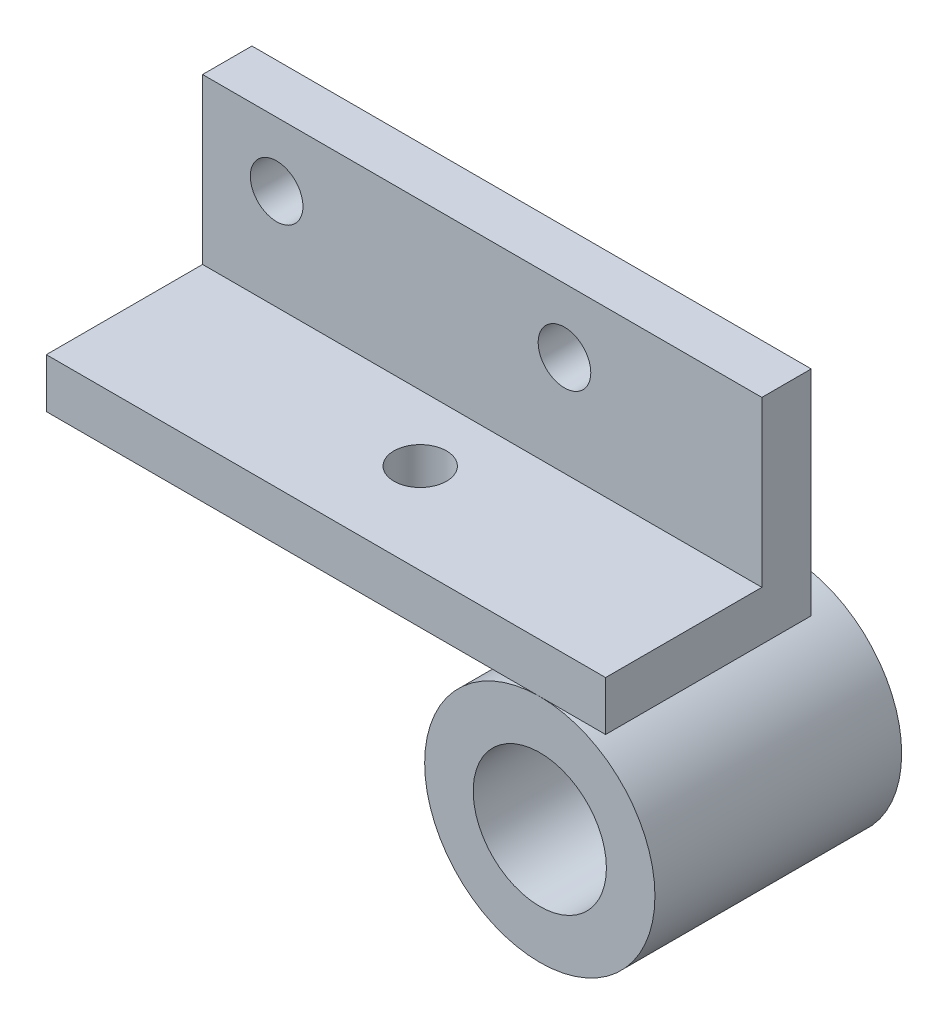
ISO-10303-21;
HEADER;
FILE_DESCRIPTION(('STEP AP214'),'2;1');
FILE_NAME('part.step','',(''),(''),'','','');
FILE_SCHEMA(('AUTOMOTIVE_DESIGN { 1 0 10303 214 1 1 1 1 }'));
ENDSEC;
DATA;
#1=APPLICATION_CONTEXT('core data for automotive mechanical design processes');
#2=APPLICATION_PROTOCOL_DEFINITION('international standard','automotive_design',2000,#1);
#3=PRODUCT_CONTEXT('',#1,'mechanical');
#4=PRODUCT('Part','Part','',(#3));
#5=PRODUCT_RELATED_PRODUCT_CATEGORY('part','',(#4));
#6=PRODUCT_DEFINITION_FORMATION('','',#4);
#7=PRODUCT_DEFINITION_CONTEXT('part definition',#1,'design');
#8=PRODUCT_DEFINITION('design','',#6,#7);
#9=PRODUCT_DEFINITION_SHAPE('','',#8);
#10=(LENGTH_UNIT() NAMED_UNIT(*) SI_UNIT(.MILLI.,.METRE.));
#11=(NAMED_UNIT(*) PLANE_ANGLE_UNIT() SI_UNIT($,.RADIAN.));
#12=(NAMED_UNIT(*) SI_UNIT($,.STERADIAN.) SOLID_ANGLE_UNIT());
#13=UNCERTAINTY_MEASURE_WITH_UNIT(LENGTH_MEASURE(1.E-05),#10,'distance_accuracy_value','');
#14=(GEOMETRIC_REPRESENTATION_CONTEXT(3) GLOBAL_UNCERTAINTY_ASSIGNED_CONTEXT((#13)) GLOBAL_UNIT_ASSIGNED_CONTEXT((#10,
#11,#12)) REPRESENTATION_CONTEXT('',''));
#15=CARTESIAN_POINT('',(0.,0.,0.));
#16=DIRECTION('',(0.,0.,1.));
#17=DIRECTION('',(1.,0.,0.));
#18=AXIS2_PLACEMENT_3D('',#15,#16,#17);
#19=CARTESIAN_POINT('',(30.,-7.,-15.));
#20=DIRECTION('',(0.,0.,1.));
#21=DIRECTION('',(1.,0.,0.));
#22=AXIS2_PLACEMENT_3D('',#19,#20,#21);
#23=CYLINDRICAL_SURFACE('',#22,7.);
#24=CARTESIAN_POINT('',(30.,-7.,-15.));
#25=DIRECTION('',(0.,0.,1.));
#26=DIRECTION('',(1.,0.,0.));
#27=AXIS2_PLACEMENT_3D('',#24,#25,#26);
#28=CIRCLE('',#27,7.);
#29=CARTESIAN_POINT('',(37.,-7.,-15.));
#30=VERTEX_POINT('',#29);
#31=EDGE_CURVE('E11',#30,#30,#28,.T.);
#32=ORIENTED_EDGE('',*,*,#31,.T.);
#33=EDGE_LOOP('',(#32));
#34=FACE_BOUND('',#33,.T.);
#35=CARTESIAN_POINT('',(30.,-7.,0.));
#36=DIRECTION('',(0.,0.,1.));
#37=DIRECTION('',(1.,0.,0.));
#38=AXIS2_PLACEMENT_3D('',#35,#36,#37);
#39=CIRCLE('',#38,7.);
#40=CARTESIAN_POINT('',(37.,-7.,0.));
#41=VERTEX_POINT('',#40);
#42=EDGE_CURVE('E46',#41,#41,#39,.T.);
#43=ORIENTED_EDGE('',*,*,#42,.F.);
#44=EDGE_LOOP('',(#43));
#45=FACE_BOUND('',#44,.T.);
#46=ADVANCED_FACE('F43',(#34,#45),#23,.T.);
#47=CARTESIAN_POINT('',(30.,-7.,-15.));
#48=DIRECTION('',(0.,0.,1.));
#49=DIRECTION('',(1.,0.,0.));
#50=AXIS2_PLACEMENT_3D('',#47,#48,#49);
#51=PLANE('',#50);
#52=CARTESIAN_POINT('',(30.,-7.,-15.));
#53=DIRECTION('',(0.,0.,1.));
#54=DIRECTION('',(1.,0.,0.));
#55=AXIS2_PLACEMENT_3D('',#52,#53,#54);
#56=CIRCLE('',#55,4.05);
#57=CARTESIAN_POINT('',(34.05,-7.,-15.));
#58=VERTEX_POINT('',#57);
#59=EDGE_CURVE('E53',#58,#58,#56,.T.);
#60=ORIENTED_EDGE('',*,*,#59,.T.);
#61=EDGE_LOOP('',(#60));
#62=FACE_BOUND('',#61,.T.);
#63=ORIENTED_EDGE('',*,*,#31,.F.);
#64=EDGE_LOOP('',(#63));
#65=FACE_BOUND('',#64,.T.);
#66=ADVANCED_FACE('F61',(#62,#65),#51,.F.);
#67=CARTESIAN_POINT('',(30.,-7.,0.));
#68=DIRECTION('',(0.,0.,1.));
#69=DIRECTION('',(1.,0.,0.));
#70=AXIS2_PLACEMENT_3D('',#67,#68,#69);
#71=PLANE('',#70);
#72=CARTESIAN_POINT('',(30.,-7.,0.));
#73=DIRECTION('',(0.,0.,1.));
#74=DIRECTION('',(1.,0.,0.));
#75=AXIS2_PLACEMENT_3D('',#72,#73,#74);
#76=CIRCLE('',#75,4.05);
#77=CARTESIAN_POINT('',(34.05,-7.,0.));
#78=VERTEX_POINT('',#77);
#79=EDGE_CURVE('E55',#78,#78,#76,.T.);
#80=ORIENTED_EDGE('',*,*,#79,.F.);
#81=EDGE_LOOP('',(#80));
#82=FACE_BOUND('',#81,.T.);
#83=ORIENTED_EDGE('',*,*,#42,.T.);
#84=EDGE_LOOP('',(#83));
#85=FACE_BOUND('',#84,.T.);
#86=ADVANCED_FACE('F67',(#82,#85),#71,.T.);
#87=CARTESIAN_POINT('',(30.,-7.,-15.));
#88=DIRECTION('',(0.,0.,1.));
#89=DIRECTION('',(1.,0.,0.));
#90=AXIS2_PLACEMENT_3D('',#87,#88,#89);
#91=CYLINDRICAL_SURFACE('',#90,4.05);
#92=ORIENTED_EDGE('',*,*,#59,.F.);
#93=EDGE_LOOP('',(#92));
#94=FACE_BOUND('',#93,.T.);
#95=ORIENTED_EDGE('',*,*,#79,.T.);
#96=EDGE_LOOP('',(#95));
#97=FACE_BOUND('',#96,.T.);
#98=ADVANCED_FACE('F64',(#94,#97),#91,.F.);
#99=CLOSED_SHELL('',(#46,#66,#86,#98));
#100=MANIFOLD_SOLID_BREP('B2',#99);
#101=CARTESIAN_POINT('',(0.,3.,0.));
#102=DIRECTION('',(1.,0.,0.));
#103=DIRECTION('',(0.,0.,-1.));
#104=AXIS2_PLACEMENT_3D('',#101,#102,#103);
#105=PLANE('',#104);
#106=DIRECTION('',(0.,0.,1.));
#107=VECTOR('',#106,1.);
#108=CARTESIAN_POINT('',(0.,0.,0.));
#109=LINE('',#108,#107);
#110=CARTESIAN_POINT('',(0.,0.,-12.5));
#111=VERTEX_POINT('',#110);
#112=CARTESIAN_POINT('',(0.,0.,0.));
#113=VERTEX_POINT('',#112);
#114=EDGE_CURVE('E167',#111,#113,#109,.T.);
#115=ORIENTED_EDGE('',*,*,#114,.T.);
#116=DIRECTION('',(0.,-1.,0.));
#117=VECTOR('',#116,1.);
#118=CARTESIAN_POINT('',(0.,3.,0.));
#119=LINE('',#118,#117);
#120=CARTESIAN_POINT('',(0.,3.,0.));
#121=VERTEX_POINT('',#120);
#122=EDGE_CURVE('E41',#121,#113,#119,.T.);
#123=ORIENTED_EDGE('',*,*,#122,.F.);
#124=DIRECTION('',(0.,0.,1.));
#125=VECTOR('',#124,1.);
#126=CARTESIAN_POINT('',(0.,3.,0.));
#127=LINE('',#126,#125);
#128=CARTESIAN_POINT('',(0.,3.,-9.5));
#129=VERTEX_POINT('',#128);
#130=EDGE_CURVE('E159',#129,#121,#127,.T.);
#131=ORIENTED_EDGE('',*,*,#130,.F.);
#132=DIRECTION('',(0.,-1.,0.));
#133=VECTOR('',#132,1.);
#134=CARTESIAN_POINT('',(0.,13.,-9.5));
#135=LINE('',#134,#133);
#136=CARTESIAN_POINT('',(0.,13.,-9.5));
#137=VERTEX_POINT('',#136);
#138=EDGE_CURVE('E121',#137,#129,#135,.T.);
#139=ORIENTED_EDGE('',*,*,#138,.F.);
#140=DIRECTION('',(0.,0.,-1.));
#141=VECTOR('',#140,1.);
#142=CARTESIAN_POINT('',(0.,13.,-9.5));
#143=LINE('',#142,#141);
#144=CARTESIAN_POINT('',(0.,13.,-12.5));
#145=VERTEX_POINT('',#144);
#146=EDGE_CURVE('E193',#137,#145,#143,.T.);
#147=ORIENTED_EDGE('',*,*,#146,.T.);
#148=DIRECTION('',(0.,-1.,0.));
#149=VECTOR('',#148,1.);
#150=CARTESIAN_POINT('',(0.,13.,-12.5));
#151=LINE('',#150,#149);
#152=EDGE_CURVE('E171',#145,#111,#151,.T.);
#153=ORIENTED_EDGE('',*,*,#152,.T.);
#154=EDGE_LOOP('',(#115,#123,#131,#139,#147,#153));
#155=FACE_BOUND('',#154,.T.);
#156=ADVANCED_FACE('F105',(#155),#105,.F.);
#157=CARTESIAN_POINT('',(0.,3.,0.));
#158=DIRECTION('',(0.,0.,-1.));
#159=DIRECTION('',(-1.,0.,0.));
#160=AXIS2_PLACEMENT_3D('',#157,#158,#159);
#161=PLANE('',#160);
#162=DIRECTION('',(1.,0.,0.));
#163=VECTOR('',#162,1.);
#164=CARTESIAN_POINT('',(0.,0.,0.));
#165=LINE('',#164,#163);
#166=CARTESIAN_POINT('',(34.,0.,0.));
#167=VERTEX_POINT('',#166);
#168=EDGE_CURVE('E134',#113,#167,#165,.T.);
#169=ORIENTED_EDGE('',*,*,#168,.T.);
#170=DIRECTION('',(0.,-1.,0.));
#171=VECTOR('',#170,1.);
#172=CARTESIAN_POINT('',(34.,3.,0.));
#173=LINE('',#172,#171);
#174=CARTESIAN_POINT('',(34.,3.,0.));
#175=VERTEX_POINT('',#174);
#176=EDGE_CURVE('E113',#175,#167,#173,.T.);
#177=ORIENTED_EDGE('',*,*,#176,.F.);
#178=DIRECTION('',(1.,0.,0.));
#179=VECTOR('',#178,1.);
#180=CARTESIAN_POINT('',(0.,3.,0.));
#181=LINE('',#180,#179);
#182=EDGE_CURVE('E148',#121,#175,#181,.T.);
#183=ORIENTED_EDGE('',*,*,#182,.F.);
#184=ORIENTED_EDGE('',*,*,#122,.T.);
#185=EDGE_LOOP('',(#169,#177,#183,#184));
#186=FACE_BOUND('',#185,.T.);
#187=ADVANCED_FACE('F150',(#186),#161,.F.);
#188=CARTESIAN_POINT('',(34.,3.,0.));
#189=DIRECTION('',(-1.,0.,0.));
#190=DIRECTION('',(0.,0.,1.));
#191=AXIS2_PLACEMENT_3D('',#188,#189,#190);
#192=PLANE('',#191);
#193=DIRECTION('',(0.,0.,-1.));
#194=VECTOR('',#193,1.);
#195=CARTESIAN_POINT('',(34.,0.,0.));
#196=LINE('',#195,#194);
#197=CARTESIAN_POINT('',(34.,0.,-12.5));
#198=VERTEX_POINT('',#197);
#199=EDGE_CURVE('E164',#167,#198,#196,.T.);
#200=ORIENTED_EDGE('',*,*,#199,.T.);
#201=DIRECTION('',(0.,-1.,0.));
#202=VECTOR('',#201,1.);
#203=CARTESIAN_POINT('',(34.,13.,-12.5));
#204=LINE('',#203,#202);
#205=CARTESIAN_POINT('',(34.,13.,-12.5));
#206=VERTEX_POINT('',#205);
#207=EDGE_CURVE('E186',#206,#198,#204,.T.);
#208=ORIENTED_EDGE('',*,*,#207,.F.);
#209=DIRECTION('',(0.,0.,1.));
#210=VECTOR('',#209,1.);
#211=CARTESIAN_POINT('',(34.,13.,-9.5));
#212=LINE('',#211,#210);
#213=CARTESIAN_POINT('',(34.,13.,-9.5));
#214=VERTEX_POINT('',#213);
#215=EDGE_CURVE('E197',#206,#214,#212,.T.);
#216=ORIENTED_EDGE('',*,*,#215,.T.);
#217=DIRECTION('',(0.,-1.,0.));
#218=VECTOR('',#217,1.);
#219=CARTESIAN_POINT('',(34.,13.,-9.5));
#220=LINE('',#219,#218);
#221=CARTESIAN_POINT('',(34.,3.,-9.5));
#222=VERTEX_POINT('',#221);
#223=EDGE_CURVE('E177',#214,#222,#220,.T.);
#224=ORIENTED_EDGE('',*,*,#223,.T.);
#225=DIRECTION('',(0.,0.,-1.));
#226=VECTOR('',#225,1.);
#227=CARTESIAN_POINT('',(34.,3.,0.));
#228=LINE('',#227,#226);
#229=EDGE_CURVE('E158',#175,#222,#228,.T.);
#230=ORIENTED_EDGE('',*,*,#229,.F.);
#231=ORIENTED_EDGE('',*,*,#176,.T.);
#232=EDGE_LOOP('',(#200,#208,#216,#224,#230,#231));
#233=FACE_BOUND('',#232,.T.);
#234=ADVANCED_FACE('F235',(#233),#192,.F.);
#235=CARTESIAN_POINT('',(0.,3.,0.));
#236=DIRECTION('',(0.,-1.,0.));
#237=DIRECTION('',(0.,0.,-1.));
#238=AXIS2_PLACEMENT_3D('',#235,#236,#237);
#239=PLANE('',#238);
#240=CARTESIAN_POINT('',(17.23,3.,-5.5));
#241=DIRECTION('',(0.,-1.,0.));
#242=DIRECTION('',(0.,0.,-1.));
#243=AXIS2_PLACEMENT_3D('',#240,#241,#242);
#244=CIRCLE('',#243,1.6);
#245=CARTESIAN_POINT('',(17.23,3.,-7.1));
#246=VERTEX_POINT('',#245);
#247=EDGE_CURVE('E211',#246,#246,#244,.F.);
#248=ORIENTED_EDGE('',*,*,#247,.F.);
#249=EDGE_LOOP('',(#248));
#250=FACE_BOUND('',#249,.T.);
#251=ORIENTED_EDGE('',*,*,#130,.T.);
#252=ORIENTED_EDGE('',*,*,#182,.T.);
#253=ORIENTED_EDGE('',*,*,#229,.T.);
#254=DIRECTION('',(-1.,0.,0.));
#255=VECTOR('',#254,1.);
#256=CARTESIAN_POINT('',(0.,3.,-9.5));
#257=LINE('',#256,#255);
#258=EDGE_CURVE('E138',#222,#129,#257,.T.);
#259=ORIENTED_EDGE('',*,*,#258,.T.);
#260=EDGE_LOOP('',(#251,#252,#253,#259));
#261=FACE_BOUND('',#260,.T.);
#262=ADVANCED_FACE('F162',(#250,#261),#239,.F.);
#263=CARTESIAN_POINT('',(0.,0.,0.));
#264=DIRECTION('',(0.,-1.,0.));
#265=DIRECTION('',(0.,0.,-1.));
#266=AXIS2_PLACEMENT_3D('',#263,#264,#265);
#267=PLANE('',#266);
#268=CARTESIAN_POINT('',(17.23,0.,-5.5));
#269=DIRECTION('',(0.,-1.,0.));
#270=DIRECTION('',(0.,0.,-1.));
#271=AXIS2_PLACEMENT_3D('',#268,#269,#270);
#272=CIRCLE('',#271,1.6);
#273=CARTESIAN_POINT('',(17.23,0.,-7.1));
#274=VERTEX_POINT('',#273);
#275=EDGE_CURVE('E218',#274,#274,#272,.T.);
#276=ORIENTED_EDGE('',*,*,#275,.F.);
#277=EDGE_LOOP('',(#276));
#278=FACE_BOUND('',#277,.T.);
#279=ORIENTED_EDGE('',*,*,#114,.F.);
#280=DIRECTION('',(1.,0.,0.));
#281=VECTOR('',#280,1.);
#282=CARTESIAN_POINT('',(0.,0.,-12.5));
#283=LINE('',#282,#281);
#284=EDGE_CURVE('E191',#111,#198,#283,.T.);
#285=ORIENTED_EDGE('',*,*,#284,.T.);
#286=ORIENTED_EDGE('',*,*,#199,.F.);
#287=ORIENTED_EDGE('',*,*,#168,.F.);
#288=EDGE_LOOP('',(#279,#285,#286,#287));
#289=FACE_BOUND('',#288,.T.);
#290=ADVANCED_FACE('F224',(#278,#289),#267,.T.);
#291=CARTESIAN_POINT('',(0.,13.,-9.5));
#292=DIRECTION('',(0.,0.,1.));
#293=DIRECTION('',(1.,0.,0.));
#294=AXIS2_PLACEMENT_3D('',#291,#292,#293);
#295=PLANE('',#294);
#296=CARTESIAN_POINT('',(4.5,9.1,-9.5));
#297=DIRECTION('',(0.,0.,1.));
#298=DIRECTION('',(1.,0.,0.));
#299=AXIS2_PLACEMENT_3D('',#296,#297,#298);
#300=CIRCLE('',#299,1.6);
#301=CARTESIAN_POINT('',(6.1,9.1,-9.5));
#302=VERTEX_POINT('',#301);
#303=EDGE_CURVE('E194',#302,#302,#300,.F.);
#304=ORIENTED_EDGE('',*,*,#303,.T.);
#305=EDGE_LOOP('',(#304));
#306=FACE_BOUND('',#305,.T.);
#307=CARTESIAN_POINT('',(22.,9.1,-9.5));
#308=DIRECTION('',(0.,0.,1.));
#309=DIRECTION('',(1.,0.,0.));
#310=AXIS2_PLACEMENT_3D('',#307,#308,#309);
#311=CIRCLE('',#310,1.6);
#312=CARTESIAN_POINT('',(23.6,9.1,-9.5));
#313=VERTEX_POINT('',#312);
#314=EDGE_CURVE('E204',#313,#313,#311,.F.);
#315=ORIENTED_EDGE('',*,*,#314,.T.);
#316=EDGE_LOOP('',(#315));
#317=FACE_BOUND('',#316,.T.);
#318=ORIENTED_EDGE('',*,*,#258,.F.);
#319=ORIENTED_EDGE('',*,*,#223,.F.);
#320=DIRECTION('',(-1.,0.,0.));
#321=VECTOR('',#320,1.);
#322=CARTESIAN_POINT('',(0.,13.,-9.5));
#323=LINE('',#322,#321);
#324=EDGE_CURVE('E187',#214,#137,#323,.T.);
#325=ORIENTED_EDGE('',*,*,#324,.T.);
#326=ORIENTED_EDGE('',*,*,#138,.T.);
#327=EDGE_LOOP('',(#318,#319,#325,#326));
#328=FACE_BOUND('',#327,.T.);
#329=ADVANCED_FACE('F226',(#306,#317,#328),#295,.T.);
#330=CARTESIAN_POINT('',(0.,13.,-12.5));
#331=DIRECTION('',(0.,0.,-1.));
#332=DIRECTION('',(-1.,0.,0.));
#333=AXIS2_PLACEMENT_3D('',#330,#331,#332);
#334=PLANE('',#333);
#335=CARTESIAN_POINT('',(4.5,9.1,-12.5));
#336=DIRECTION('',(0.,0.,-1.));
#337=DIRECTION('',(-1.,0.,0.));
#338=AXIS2_PLACEMENT_3D('',#335,#336,#337);
#339=CIRCLE('',#338,1.6);
#340=CARTESIAN_POINT('',(2.9,9.1,-12.5));
#341=VERTEX_POINT('',#340);
#342=EDGE_CURVE('E207',#341,#341,#339,.T.);
#343=ORIENTED_EDGE('',*,*,#342,.F.);
#344=EDGE_LOOP('',(#343));
#345=FACE_BOUND('',#344,.T.);
#346=CARTESIAN_POINT('',(22.,9.1,-12.5));
#347=DIRECTION('',(0.,0.,-1.));
#348=DIRECTION('',(-1.,0.,0.));
#349=AXIS2_PLACEMENT_3D('',#346,#347,#348);
#350=CIRCLE('',#349,1.6);
#351=CARTESIAN_POINT('',(20.4,9.1,-12.5));
#352=VERTEX_POINT('',#351);
#353=EDGE_CURVE('E208',#352,#352,#350,.T.);
#354=ORIENTED_EDGE('',*,*,#353,.F.);
#355=EDGE_LOOP('',(#354));
#356=FACE_BOUND('',#355,.T.);
#357=ORIENTED_EDGE('',*,*,#284,.F.);
#358=ORIENTED_EDGE('',*,*,#152,.F.);
#359=DIRECTION('',(1.,0.,0.));
#360=VECTOR('',#359,1.);
#361=CARTESIAN_POINT('',(0.,13.,-12.5));
#362=LINE('',#361,#360);
#363=EDGE_CURVE('E200',#145,#206,#362,.T.);
#364=ORIENTED_EDGE('',*,*,#363,.T.);
#365=ORIENTED_EDGE('',*,*,#207,.T.);
#366=EDGE_LOOP('',(#357,#358,#364,#365));
#367=FACE_BOUND('',#366,.T.);
#368=ADVANCED_FACE('F232',(#345,#356,#367),#334,.T.);
#369=CARTESIAN_POINT('',(0.,13.,0.));
#370=DIRECTION('',(0.,-1.,0.));
#371=DIRECTION('',(0.,0.,-1.));
#372=AXIS2_PLACEMENT_3D('',#369,#370,#371);
#373=PLANE('',#372);
#374=ORIENTED_EDGE('',*,*,#146,.F.);
#375=ORIENTED_EDGE('',*,*,#324,.F.);
#376=ORIENTED_EDGE('',*,*,#215,.F.);
#377=ORIENTED_EDGE('',*,*,#363,.F.);
#378=EDGE_LOOP('',(#374,#375,#376,#377));
#379=FACE_BOUND('',#378,.T.);
#380=ADVANCED_FACE('F257',(#379),#373,.F.);
#381=CARTESIAN_POINT('',(22.,9.1,-4.97451660040609));
#382=DIRECTION('',(0.,0.,-1.));
#383=DIRECTION('',(-1.,0.,0.));
#384=AXIS2_PLACEMENT_3D('',#381,#382,#383);
#385=CYLINDRICAL_SURFACE('',#384,1.6);
#386=ORIENTED_EDGE('',*,*,#353,.T.);
#387=EDGE_LOOP('',(#386));
#388=FACE_BOUND('',#387,.T.);
#389=ORIENTED_EDGE('',*,*,#314,.F.);
#390=EDGE_LOOP('',(#389));
#391=FACE_BOUND('',#390,.T.);
#392=ADVANCED_FACE('F262',(#388,#391),#385,.F.);
#393=CARTESIAN_POINT('',(4.5,9.1,-4.97451660040609));
#394=DIRECTION('',(0.,0.,-1.));
#395=DIRECTION('',(-1.,0.,0.));
#396=AXIS2_PLACEMENT_3D('',#393,#394,#395);
#397=CYLINDRICAL_SURFACE('',#396,1.6);
#398=ORIENTED_EDGE('',*,*,#342,.T.);
#399=EDGE_LOOP('',(#398));
#400=FACE_BOUND('',#399,.T.);
#401=ORIENTED_EDGE('',*,*,#303,.F.);
#402=EDGE_LOOP('',(#401));
#403=FACE_BOUND('',#402,.T.);
#404=ADVANCED_FACE('F268',(#400,#403),#397,.F.);
#405=CARTESIAN_POINT('',(17.23,7.52548339959391,-5.5));
#406=DIRECTION('',(0.,-1.,0.));
#407=DIRECTION('',(0.,0.,-1.));
#408=AXIS2_PLACEMENT_3D('',#405,#406,#407);
#409=CYLINDRICAL_SURFACE('',#408,1.6);
#410=CARTESIAN_POINT('',(17.23,3.,-7.1));
#411=CARTESIAN_POINT('',(17.23,2.96875,-7.1));
#412=CARTESIAN_POINT('',(17.23,2.9375,-7.1));
#413=CARTESIAN_POINT('',(17.23,2.875,-7.1));
#414=CARTESIAN_POINT('',(17.23,2.84375,-7.1));
#415=CARTESIAN_POINT('',(17.23,2.78125,-7.1));
#416=CARTESIAN_POINT('',(17.23,2.75,-7.1));
#417=CARTESIAN_POINT('',(17.23,2.6875,-7.1));
#418=CARTESIAN_POINT('',(17.23,2.65625,-7.1));
#419=CARTESIAN_POINT('',(17.23,2.59375,-7.1));
#420=CARTESIAN_POINT('',(17.23,2.5625,-7.1));
#421=CARTESIAN_POINT('',(17.23,2.5,-7.1));
#422=CARTESIAN_POINT('',(17.23,2.46875,-7.1));
#423=CARTESIAN_POINT('',(17.23,2.40625,-7.1));
#424=CARTESIAN_POINT('',(17.23,2.375,-7.1));
#425=CARTESIAN_POINT('',(17.23,2.3125,-7.1));
#426=CARTESIAN_POINT('',(17.23,2.28125,-7.1));
#427=CARTESIAN_POINT('',(17.23,2.21875,-7.1));
#428=CARTESIAN_POINT('',(17.23,2.1875,-7.1));
#429=CARTESIAN_POINT('',(17.23,2.125,-7.1));
#430=CARTESIAN_POINT('',(17.23,2.09375,-7.1));
#431=CARTESIAN_POINT('',(17.23,2.03125,-7.1));
#432=CARTESIAN_POINT('',(17.23,2.,-7.1));
#433=CARTESIAN_POINT('',(17.23,1.9375,-7.1));
#434=CARTESIAN_POINT('',(17.23,1.90625,-7.1));
#435=CARTESIAN_POINT('',(17.23,1.84375,-7.1));
#436=CARTESIAN_POINT('',(17.23,1.8125,-7.1));
#437=CARTESIAN_POINT('',(17.23,1.75,-7.1));
#438=CARTESIAN_POINT('',(17.23,1.71875,-7.1));
#439=CARTESIAN_POINT('',(17.23,1.65625,-7.1));
#440=CARTESIAN_POINT('',(17.23,1.625,-7.1));
#441=CARTESIAN_POINT('',(17.23,1.5625,-7.1));
#442=CARTESIAN_POINT('',(17.23,1.53125,-7.1));
#443=CARTESIAN_POINT('',(17.23,1.46875,-7.1));
#444=CARTESIAN_POINT('',(17.23,1.4375,-7.1));
#445=CARTESIAN_POINT('',(17.23,1.375,-7.1));
#446=CARTESIAN_POINT('',(17.23,1.34375,-7.1));
#447=CARTESIAN_POINT('',(17.23,1.28125,-7.1));
#448=CARTESIAN_POINT('',(17.23,1.25,-7.1));
#449=CARTESIAN_POINT('',(17.23,1.1875,-7.1));
#450=CARTESIAN_POINT('',(17.23,1.15625,-7.1));
#451=CARTESIAN_POINT('',(17.23,1.09375,-7.1));
#452=CARTESIAN_POINT('',(17.23,1.0625,-7.1));
#453=CARTESIAN_POINT('',(17.23,1.,-7.1));
#454=CARTESIAN_POINT('',(17.23,0.968750000000001,-7.1));
#455=CARTESIAN_POINT('',(17.23,0.906250000000001,-7.1));
#456=CARTESIAN_POINT('',(17.23,0.875000000000001,-7.1));
#457=CARTESIAN_POINT('',(17.23,0.812500000000001,-7.1));
#458=CARTESIAN_POINT('',(17.23,0.781250000000001,-7.1));
#459=CARTESIAN_POINT('',(17.23,0.718750000000001,-7.1));
#460=CARTESIAN_POINT('',(17.23,0.687500000000001,-7.1));
#461=CARTESIAN_POINT('',(17.23,0.625000000000001,-7.1));
#462=CARTESIAN_POINT('',(17.23,0.593750000000001,-7.1));
#463=CARTESIAN_POINT('',(17.23,0.53125,-7.1));
#464=CARTESIAN_POINT('',(17.23,0.5,-7.1));
#465=CARTESIAN_POINT('',(17.23,0.4375,-7.1));
#466=CARTESIAN_POINT('',(17.23,0.40625,-7.1));
#467=CARTESIAN_POINT('',(17.23,0.34375,-7.1));
#468=CARTESIAN_POINT('',(17.23,0.3125,-7.1));
#469=CARTESIAN_POINT('',(17.23,0.25,-7.1));
#470=CARTESIAN_POINT('',(17.23,0.21875,-7.1));
#471=CARTESIAN_POINT('',(17.23,0.15625,-7.1));
#472=CARTESIAN_POINT('',(17.23,0.125,-7.1));
#473=CARTESIAN_POINT('',(17.23,0.0625000000000001,-7.1));
#474=CARTESIAN_POINT('',(17.23,0.03125,-7.1));
#475=CARTESIAN_POINT('',(17.23,0.,-7.1));
#476=B_SPLINE_CURVE_WITH_KNOTS('',3,(#410,#411,#412,#413,#414,#415,#416,#417,#418,#419,#420,
#421,#422,#423,#424,#425,#426,#427,#428,#429,#430,#431,#432,#433,#434,#435,#436,#437,#438,#439,
#440,#441,#442,#443,#444,#445,#446,#447,#448,#449,#450,#451,#452,#453,#454,#455,#456,#457,#458,
#459,#460,#461,#462,#463,#464,#465,#466,#467,#468,#469,#470,#471,#472,#473,#474,#475),
.UNSPECIFIED.,.F.,.F.,(4,2,2,2,2,2,2,2,2,2,2,2,2,2,2,2,2,2,2,2,2,2,2,2,2,2,2,2,2,2,2,2,4),(0.,
0.0937500000000001,0.1875,0.28125,0.375,0.46875,0.5625,0.656250000000001,0.750000000000001,
0.843750000000001,0.9375,1.03125,1.125,1.21875,1.3125,1.40625,1.5,1.59375,1.6875,1.78125,1.875,
1.96875,2.0625,2.15625,2.25,2.34375,2.4375,2.53125,2.625,2.71875,2.8125,2.90625,3.),.UNSPECIFIED.);
#477=EDGE_CURVE('BSEAM222',#246,#274,#476,.T.);
#478=ORIENTED_EDGE('',*,*,#247,.T.);
#479=ORIENTED_EDGE('',*,*,#275,.T.);
#480=ORIENTED_EDGE('',*,*,#477,.T.);
#481=ORIENTED_EDGE('',*,*,#477,.F.);
#482=EDGE_LOOP('',(#478,#480,#479,#481));
#483=FACE_BOUND('',#482,.T.);
#484=ADVANCED_FACE('F222',(#483),#409,.F.);
#485=CLOSED_SHELL('',(#156,#187,#234,#262,#290,#329,#368,#380,#392,#404,#484));
#486=MANIFOLD_SOLID_BREP('B6',#485);
#487=ADVANCED_BREP_SHAPE_REPRESENTATION('',(#18,#100,#486),#14);
#488=SHAPE_DEFINITION_REPRESENTATION(#9,#487);
ENDSEC;
END-ISO-10303-21;
